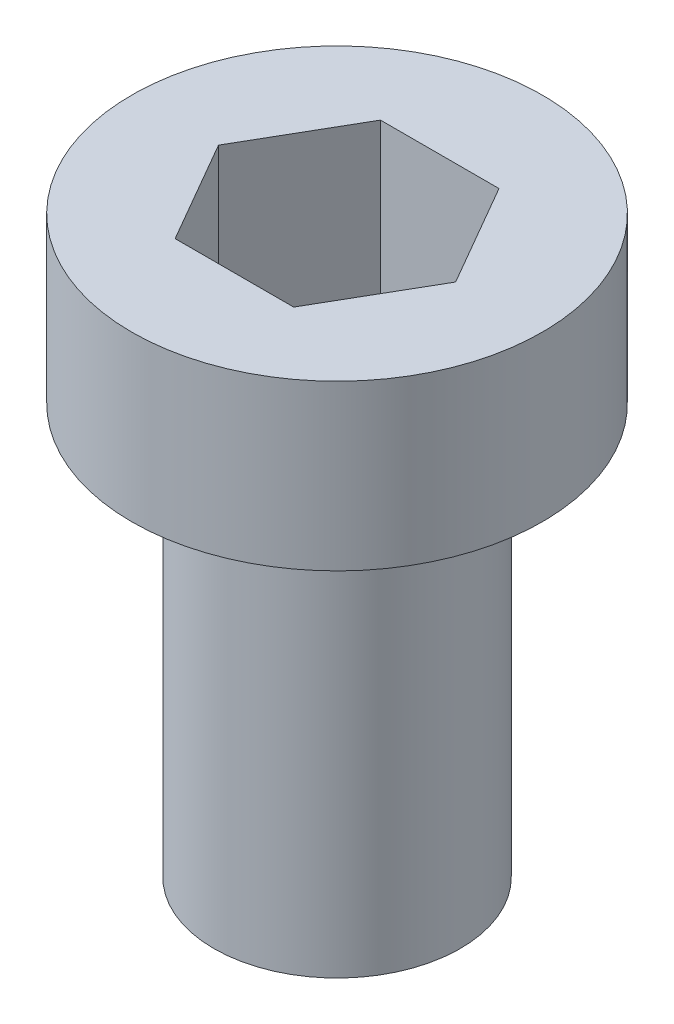
ISO-10303-21;
HEADER;
FILE_DESCRIPTION(('STEP AP214'),'2;1');
FILE_NAME('part.step','',(''),(''),'','','');
FILE_SCHEMA(('AUTOMOTIVE_DESIGN { 1 0 10303 214 1 1 1 1 }'));
ENDSEC;
DATA;
#1=APPLICATION_CONTEXT('core data for automotive mechanical design processes');
#2=APPLICATION_PROTOCOL_DEFINITION('international standard','automotive_design',2000,#1);
#3=PRODUCT_CONTEXT('',#1,'mechanical');
#4=PRODUCT('Part','Part','',(#3));
#5=PRODUCT_RELATED_PRODUCT_CATEGORY('part','',(#4));
#6=PRODUCT_DEFINITION_FORMATION('','',#4);
#7=PRODUCT_DEFINITION_CONTEXT('part definition',#1,'design');
#8=PRODUCT_DEFINITION('design','',#6,#7);
#9=PRODUCT_DEFINITION_SHAPE('','',#8);
#10=(LENGTH_UNIT() NAMED_UNIT(*) SI_UNIT(.MILLI.,.METRE.));
#11=(NAMED_UNIT(*) PLANE_ANGLE_UNIT() SI_UNIT($,.RADIAN.));
#12=(NAMED_UNIT(*) SI_UNIT($,.STERADIAN.) SOLID_ANGLE_UNIT());
#13=UNCERTAINTY_MEASURE_WITH_UNIT(LENGTH_MEASURE(1.E-05),#10,'distance_accuracy_value','');
#14=(GEOMETRIC_REPRESENTATION_CONTEXT(3) GLOBAL_UNCERTAINTY_ASSIGNED_CONTEXT((#13)) GLOBAL_UNIT_ASSIGNED_CONTEXT((#10,
#11,#12)) REPRESENTATION_CONTEXT('',''));
#15=CARTESIAN_POINT('',(0.,0.,0.));
#16=DIRECTION('',(0.,0.,1.));
#17=DIRECTION('',(1.,0.,0.));
#18=AXIS2_PLACEMENT_3D('',#15,#16,#17);
#19=CARTESIAN_POINT('',(0.,-10.,0.));
#20=DIRECTION('',(0.,1.,0.));
#21=DIRECTION('',(0.,0.,1.));
#22=AXIS2_PLACEMENT_3D('',#19,#20,#21);
#23=CYLINDRICAL_SURFACE('',#22,3.);
#24=CARTESIAN_POINT('',(0.,-10.,0.));
#25=DIRECTION('',(0.,1.,0.));
#26=DIRECTION('',(0.,0.,1.));
#27=AXIS2_PLACEMENT_3D('',#24,#25,#26);
#28=CIRCLE('',#27,3.);
#29=CARTESIAN_POINT('',(0.,-10.,3.));
#30=VERTEX_POINT('',#29);
#31=EDGE_CURVE('E11',#30,#30,#28,.T.);
#32=ORIENTED_EDGE('',*,*,#31,.T.);
#33=EDGE_LOOP('',(#32));
#34=FACE_BOUND('',#33,.T.);
#35=CARTESIAN_POINT('',(0.,0.,0.));
#36=DIRECTION('',(0.,1.,0.));
#37=DIRECTION('',(0.,0.,1.));
#38=AXIS2_PLACEMENT_3D('',#35,#36,#37);
#39=CIRCLE('',#38,3.);
#40=CARTESIAN_POINT('',(0.,0.,3.));
#41=VERTEX_POINT('',#40);
#42=EDGE_CURVE('E33',#41,#41,#39,.T.);
#43=ORIENTED_EDGE('',*,*,#42,.F.);
#44=EDGE_LOOP('',(#43));
#45=FACE_BOUND('',#44,.T.);
#46=ADVANCED_FACE('F30',(#34,#45),#23,.T.);
#47=CARTESIAN_POINT('',(0.,-10.,0.));
#48=DIRECTION('',(0.,1.,0.));
#49=DIRECTION('',(0.,0.,1.));
#50=AXIS2_PLACEMENT_3D('',#47,#48,#49);
#51=PLANE('',#50);
#52=ORIENTED_EDGE('',*,*,#31,.F.);
#53=EDGE_LOOP('',(#52));
#54=FACE_BOUND('',#53,.T.);
#55=ADVANCED_FACE('F151',(#54),#51,.F.);
#56=CARTESIAN_POINT('',(0.,4.,0.));
#57=DIRECTION('',(0.,1.,0.));
#58=DIRECTION('',(0.,0.,1.));
#59=AXIS2_PLACEMENT_3D('',#56,#57,#58);
#60=PLANE('',#59);
#61=CARTESIAN_POINT('',(0.,4.,0.));
#62=DIRECTION('',(0.,1.,0.));
#63=DIRECTION('',(0.,0.,1.));
#64=AXIS2_PLACEMENT_3D('',#61,#62,#63);
#65=CIRCLE('',#64,5.);
#66=CARTESIAN_POINT('',(0.,4.,5.));
#67=VERTEX_POINT('',#66);
#68=EDGE_CURVE('E133',#67,#67,#65,.T.);
#69=ORIENTED_EDGE('',*,*,#68,.T.);
#70=EDGE_LOOP('',(#69));
#71=FACE_BOUND('',#70,.T.);
#72=DIRECTION('',(-0.499999999999998,0.,-0.86602540378444));
#73=VECTOR('',#72,1.);
#74=CARTESIAN_POINT('',(2.88675134594813,4.,0.));
#75=LINE('',#74,#73);
#76=CARTESIAN_POINT('',(2.88675134594813,4.,0.));
#77=VERTEX_POINT('',#76);
#78=CARTESIAN_POINT('',(1.44337567297408,4.,-2.49999999999999));
#79=VERTEX_POINT('',#78);
#80=EDGE_CURVE('E90',#77,#79,#75,.T.);
#81=ORIENTED_EDGE('',*,*,#80,.F.);
#82=DIRECTION('',(0.500000000000002,0.,-0.866025403784438));
#83=VECTOR('',#82,1.);
#84=CARTESIAN_POINT('',(1.44337567297407,4.,2.49999999999999));
#85=LINE('',#84,#83);
#86=CARTESIAN_POINT('',(1.44337567297407,4.,2.49999999999999));
#87=VERTEX_POINT('',#86);
#88=EDGE_CURVE('E81',#87,#77,#85,.T.);
#89=ORIENTED_EDGE('',*,*,#88,.F.);
#90=DIRECTION('',(1.,0.,0.));
#91=VECTOR('',#90,1.);
#92=CARTESIAN_POINT('',(-1.44337567297405,4.,2.49999999999998));
#93=LINE('',#92,#91);
#94=CARTESIAN_POINT('',(-1.44337567297405,4.,2.49999999999998));
#95=VERTEX_POINT('',#94);
#96=EDGE_CURVE('E111',#95,#87,#93,.T.);
#97=ORIENTED_EDGE('',*,*,#96,.F.);
#98=DIRECTION('',(0.499999999999998,0.,0.86602540378444));
#99=VECTOR('',#98,1.);
#100=CARTESIAN_POINT('',(-2.88675134594811,4.,0.));
#101=LINE('',#100,#99);
#102=CARTESIAN_POINT('',(-2.88675134594811,4.,0.));
#103=VERTEX_POINT('',#102);
#104=EDGE_CURVE('E108',#103,#95,#101,.T.);
#105=ORIENTED_EDGE('',*,*,#104,.F.);
#106=DIRECTION('',(-0.500000000000002,0.,0.866025403784437));
#107=VECTOR('',#106,1.);
#108=CARTESIAN_POINT('',(-1.44337567297404,4.,-2.5));
#109=LINE('',#108,#107);
#110=CARTESIAN_POINT('',(-1.44337567297404,4.,-2.5));
#111=VERTEX_POINT('',#110);
#112=EDGE_CURVE('E104',#111,#103,#109,.T.);
#113=ORIENTED_EDGE('',*,*,#112,.F.);
#114=DIRECTION('',(-1.,0.,0.));
#115=VECTOR('',#114,1.);
#116=CARTESIAN_POINT('',(1.44337567297408,4.,-2.49999999999999));
#117=LINE('',#116,#115);
#118=EDGE_CURVE('E102',#79,#111,#117,.T.);
#119=ORIENTED_EDGE('',*,*,#118,.F.);
#120=EDGE_LOOP('',(#81,#89,#97,#105,#113,#119));
#121=FACE_BOUND('',#120,.T.);
#122=ADVANCED_FACE('F100',(#71,#121),#60,.T.);
#123=CARTESIAN_POINT('',(0.,0.,0.));
#124=DIRECTION('',(0.,1.,0.));
#125=DIRECTION('',(0.,0.,1.));
#126=AXIS2_PLACEMENT_3D('',#123,#124,#125);
#127=PLANE('',#126);
#128=ORIENTED_EDGE('',*,*,#42,.T.);
#129=EDGE_LOOP('',(#128));
#130=FACE_BOUND('',#129,.T.);
#131=CARTESIAN_POINT('',(0.,0.,0.));
#132=DIRECTION('',(0.,1.,0.));
#133=DIRECTION('',(0.,0.,1.));
#134=AXIS2_PLACEMENT_3D('',#131,#132,#133);
#135=CIRCLE('',#134,5.);
#136=CARTESIAN_POINT('',(0.,0.,5.));
#137=VERTEX_POINT('',#136);
#138=EDGE_CURVE('E96',#137,#137,#135,.T.);
#139=ORIENTED_EDGE('',*,*,#138,.F.);
#140=EDGE_LOOP('',(#139));
#141=FACE_BOUND('',#140,.T.);
#142=ADVANCED_FACE('F141',(#130,#141),#127,.F.);
#143=CARTESIAN_POINT('',(0.,4.,0.));
#144=DIRECTION('',(0.,-1.,0.));
#145=DIRECTION('',(0.,0.,-1.));
#146=AXIS2_PLACEMENT_3D('',#143,#144,#145);
#147=CYLINDRICAL_SURFACE('',#146,5.);
#148=ORIENTED_EDGE('',*,*,#68,.F.);
#149=EDGE_LOOP('',(#148));
#150=FACE_BOUND('',#149,.T.);
#151=ORIENTED_EDGE('',*,*,#138,.T.);
#152=EDGE_LOOP('',(#151));
#153=FACE_BOUND('',#152,.T.);
#154=ADVANCED_FACE('F139',(#150,#153),#147,.T.);
#155=CARTESIAN_POINT('',(1.44337567297407,4.,2.49999999999999));
#156=DIRECTION('',(-0.866025403784438,0.,-0.500000000000002));
#157=DIRECTION('',(-0.500000000000002,0.,0.866025403784438));
#158=AXIS2_PLACEMENT_3D('',#155,#156,#157);
#159=PLANE('',#158);
#160=DIRECTION('',(0.500000000000002,0.,-0.866025403784438));
#161=VECTOR('',#160,1.);
#162=CARTESIAN_POINT('',(1.44337567297407,0.,2.49999999999999));
#163=LINE('',#162,#161);
#164=CARTESIAN_POINT('',(1.44337567297407,0.,2.49999999999999));
#165=VERTEX_POINT('',#164);
#166=CARTESIAN_POINT('',(2.88675134594813,0.,0.));
#167=VERTEX_POINT('',#166);
#168=EDGE_CURVE('E44',#165,#167,#163,.T.);
#169=ORIENTED_EDGE('',*,*,#168,.F.);
#170=DIRECTION('',(0.,-1.,0.));
#171=VECTOR('',#170,1.);
#172=CARTESIAN_POINT('',(1.44337567297407,4.,2.49999999999999));
#173=LINE('',#172,#171);
#174=EDGE_CURVE('E86',#87,#165,#173,.T.);
#175=ORIENTED_EDGE('',*,*,#174,.F.);
#176=ORIENTED_EDGE('',*,*,#88,.T.);
#177=DIRECTION('',(0.,-1.,0.));
#178=VECTOR('',#177,1.);
#179=CARTESIAN_POINT('',(2.88675134594813,4.,0.));
#180=LINE('',#179,#178);
#181=EDGE_CURVE('E84',#77,#167,#180,.T.);
#182=ORIENTED_EDGE('',*,*,#181,.T.);
#183=EDGE_LOOP('',(#169,#175,#176,#182));
#184=FACE_BOUND('',#183,.T.);
#185=ADVANCED_FACE('F83',(#184),#159,.T.);
#186=CARTESIAN_POINT('',(2.88675134594813,4.,0.));
#187=DIRECTION('',(-0.86602540378444,0.,0.499999999999998));
#188=DIRECTION('',(0.499999999999998,0.,0.86602540378444));
#189=AXIS2_PLACEMENT_3D('',#186,#187,#188);
#190=PLANE('',#189);
#191=DIRECTION('',(-0.499999999999998,0.,-0.86602540378444));
#192=VECTOR('',#191,1.);
#193=CARTESIAN_POINT('',(2.88675134594813,0.,0.));
#194=LINE('',#193,#192);
#195=CARTESIAN_POINT('',(1.44337567297408,0.,-2.49999999999999));
#196=VERTEX_POINT('',#195);
#197=EDGE_CURVE('E48',#167,#196,#194,.T.);
#198=ORIENTED_EDGE('',*,*,#197,.F.);
#199=ORIENTED_EDGE('',*,*,#181,.F.);
#200=ORIENTED_EDGE('',*,*,#80,.T.);
#201=DIRECTION('',(0.,-1.,0.));
#202=VECTOR('',#201,1.);
#203=CARTESIAN_POINT('',(1.44337567297408,4.,-2.49999999999999));
#204=LINE('',#203,#202);
#205=EDGE_CURVE('E97',#79,#196,#204,.T.);
#206=ORIENTED_EDGE('',*,*,#205,.T.);
#207=EDGE_LOOP('',(#198,#199,#200,#206));
#208=FACE_BOUND('',#207,.T.);
#209=ADVANCED_FACE('F94',(#208),#190,.T.);
#210=CARTESIAN_POINT('',(1.44337567297408,4.,-2.49999999999999));
#211=DIRECTION('',(0.,0.,1.));
#212=DIRECTION('',(1.,0.,0.));
#213=AXIS2_PLACEMENT_3D('',#210,#211,#212);
#214=PLANE('',#213);
#215=DIRECTION('',(-1.,0.,0.));
#216=VECTOR('',#215,1.);
#217=CARTESIAN_POINT('',(1.44337567297408,0.,-2.49999999999999));
#218=LINE('',#217,#216);
#219=CARTESIAN_POINT('',(-1.44337567297404,0.,-2.5));
#220=VERTEX_POINT('',#219);
#221=EDGE_CURVE('E115',#196,#220,#218,.T.);
#222=ORIENTED_EDGE('',*,*,#221,.F.);
#223=ORIENTED_EDGE('',*,*,#205,.F.);
#224=ORIENTED_EDGE('',*,*,#118,.T.);
#225=DIRECTION('',(0.,-1.,0.));
#226=VECTOR('',#225,1.);
#227=CARTESIAN_POINT('',(-1.44337567297404,4.,-2.5));
#228=LINE('',#227,#226);
#229=EDGE_CURVE('E129',#111,#220,#228,.T.);
#230=ORIENTED_EDGE('',*,*,#229,.T.);
#231=EDGE_LOOP('',(#222,#223,#224,#230));
#232=FACE_BOUND('',#231,.T.);
#233=ADVANCED_FACE('F186',(#232),#214,.T.);
#234=CARTESIAN_POINT('',(-1.44337567297404,4.,-2.5));
#235=DIRECTION('',(0.866025403784437,0.,0.500000000000002));
#236=DIRECTION('',(0.500000000000002,0.,-0.866025403784437));
#237=AXIS2_PLACEMENT_3D('',#234,#235,#236);
#238=PLANE('',#237);
#239=DIRECTION('',(-0.500000000000002,0.,0.866025403784437));
#240=VECTOR('',#239,1.);
#241=CARTESIAN_POINT('',(-1.44337567297404,0.,-2.5));
#242=LINE('',#241,#240);
#243=CARTESIAN_POINT('',(-2.88675134594811,0.,0.));
#244=VERTEX_POINT('',#243);
#245=EDGE_CURVE('E117',#220,#244,#242,.T.);
#246=ORIENTED_EDGE('',*,*,#245,.F.);
#247=ORIENTED_EDGE('',*,*,#229,.F.);
#248=ORIENTED_EDGE('',*,*,#112,.T.);
#249=DIRECTION('',(0.,-1.,0.));
#250=VECTOR('',#249,1.);
#251=CARTESIAN_POINT('',(-2.88675134594811,4.,0.));
#252=LINE('',#251,#250);
#253=EDGE_CURVE('E126',#103,#244,#252,.T.);
#254=ORIENTED_EDGE('',*,*,#253,.T.);
#255=EDGE_LOOP('',(#246,#247,#248,#254));
#256=FACE_BOUND('',#255,.T.);
#257=ADVANCED_FACE('F179',(#256),#238,.T.);
#258=CARTESIAN_POINT('',(-2.88675134594811,4.,0.));
#259=DIRECTION('',(0.86602540378444,0.,-0.499999999999998));
#260=DIRECTION('',(-0.499999999999998,0.,-0.86602540378444));
#261=AXIS2_PLACEMENT_3D('',#258,#259,#260);
#262=PLANE('',#261);
#263=DIRECTION('',(0.499999999999998,0.,0.86602540378444));
#264=VECTOR('',#263,1.);
#265=CARTESIAN_POINT('',(-2.88675134594811,0.,0.));
#266=LINE('',#265,#264);
#267=CARTESIAN_POINT('',(-1.44337567297405,0.,2.49999999999998));
#268=VERTEX_POINT('',#267);
#269=EDGE_CURVE('E119',#244,#268,#266,.T.);
#270=ORIENTED_EDGE('',*,*,#269,.F.);
#271=ORIENTED_EDGE('',*,*,#253,.F.);
#272=ORIENTED_EDGE('',*,*,#104,.T.);
#273=DIRECTION('',(0.,-1.,0.));
#274=VECTOR('',#273,1.);
#275=CARTESIAN_POINT('',(-1.44337567297405,4.,2.49999999999998));
#276=LINE('',#275,#274);
#277=EDGE_CURVE('E123',#95,#268,#276,.T.);
#278=ORIENTED_EDGE('',*,*,#277,.T.);
#279=EDGE_LOOP('',(#270,#271,#272,#278));
#280=FACE_BOUND('',#279,.T.);
#281=ADVANCED_FACE('F173',(#280),#262,.T.);
#282=CARTESIAN_POINT('',(-1.44337567297405,4.,2.49999999999998));
#283=DIRECTION('',(0.,0.,-1.));
#284=DIRECTION('',(-1.,0.,0.));
#285=AXIS2_PLACEMENT_3D('',#282,#283,#284);
#286=PLANE('',#285);
#287=DIRECTION('',(1.,0.,0.));
#288=VECTOR('',#287,1.);
#289=CARTESIAN_POINT('',(-1.44337567297405,0.,2.49999999999998));
#290=LINE('',#289,#288);
#291=EDGE_CURVE('E91',#268,#165,#290,.T.);
#292=ORIENTED_EDGE('',*,*,#291,.F.);
#293=ORIENTED_EDGE('',*,*,#277,.F.);
#294=ORIENTED_EDGE('',*,*,#96,.T.);
#295=ORIENTED_EDGE('',*,*,#174,.T.);
#296=EDGE_LOOP('',(#292,#293,#294,#295));
#297=FACE_BOUND('',#296,.T.);
#298=ADVANCED_FACE('F169',(#297),#286,.T.);
#299=CARTESIAN_POINT('',(0.,0.,0.));
#300=DIRECTION('',(0.,1.,0.));
#301=DIRECTION('',(0.,0.,1.));
#302=AXIS2_PLACEMENT_3D('',#299,#300,#301);
#303=PLANE('',#302);
#304=ORIENTED_EDGE('',*,*,#168,.T.);
#305=ORIENTED_EDGE('',*,*,#197,.T.);
#306=ORIENTED_EDGE('',*,*,#221,.T.);
#307=ORIENTED_EDGE('',*,*,#245,.T.);
#308=ORIENTED_EDGE('',*,*,#269,.T.);
#309=ORIENTED_EDGE('',*,*,#291,.T.);
#310=EDGE_LOOP('',(#304,#305,#306,#307,#308,#309));
#311=FACE_BOUND('',#310,.T.);
#312=ADVANCED_FACE('F167',(#311),#303,.T.);
#313=CLOSED_SHELL('',(#46,#55,#122,#142,#154,#185,#209,#233,#257,#281,#298,#312));
#314=MANIFOLD_SOLID_BREP('B2',#313);
#315=ADVANCED_BREP_SHAPE_REPRESENTATION('',(#18,#314),#14);
#316=SHAPE_DEFINITION_REPRESENTATION(#9,#315);
ENDSEC;
END-ISO-10303-21;
